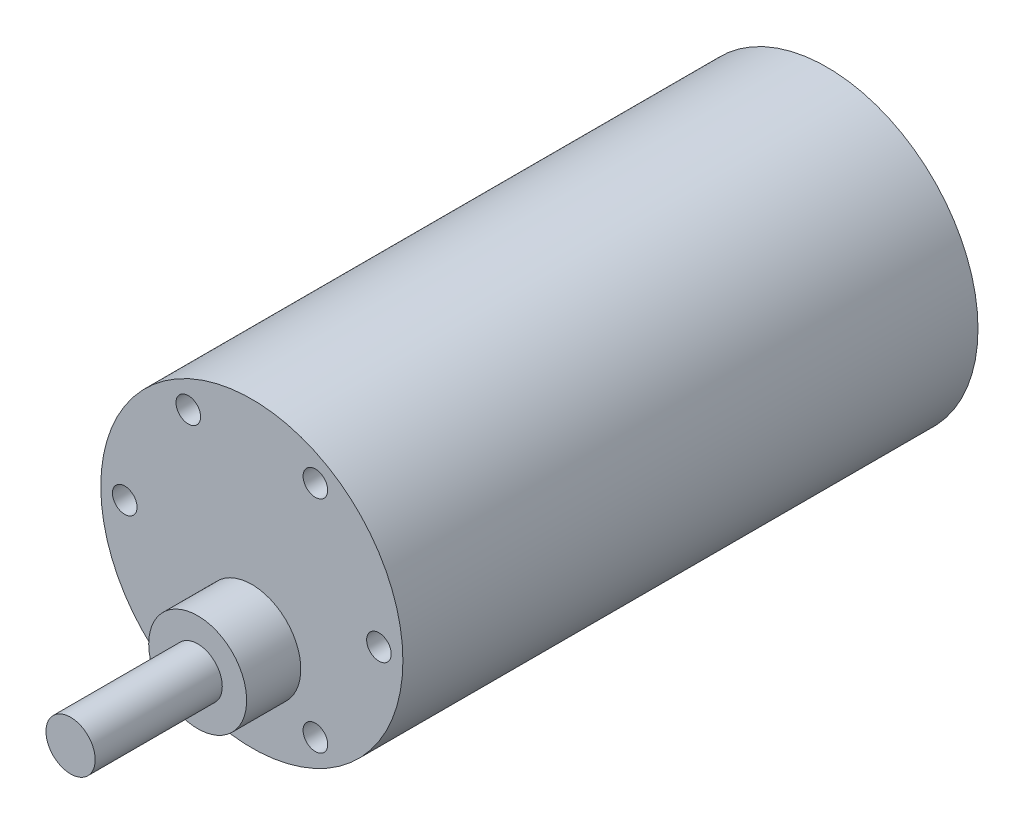
ISO-10303-21;
HEADER;
FILE_DESCRIPTION(('STEP AP214'),'2;1');
FILE_NAME('part.step','',(''),(''),'','','');
FILE_SCHEMA(('AUTOMOTIVE_DESIGN { 1 0 10303 214 1 1 1 1 }'));
ENDSEC;
DATA;
#1=APPLICATION_CONTEXT('core data for automotive mechanical design processes');
#2=APPLICATION_PROTOCOL_DEFINITION('international standard','automotive_design',2000,#1);
#3=PRODUCT_CONTEXT('',#1,'mechanical');
#4=PRODUCT('Part','Part','',(#3));
#5=PRODUCT_RELATED_PRODUCT_CATEGORY('part','',(#4));
#6=PRODUCT_DEFINITION_FORMATION('','',#4);
#7=PRODUCT_DEFINITION_CONTEXT('part definition',#1,'design');
#8=PRODUCT_DEFINITION('design','',#6,#7);
#9=PRODUCT_DEFINITION_SHAPE('','',#8);
#10=(LENGTH_UNIT() NAMED_UNIT(*) SI_UNIT(.MILLI.,.METRE.));
#11=(NAMED_UNIT(*) PLANE_ANGLE_UNIT() SI_UNIT($,.RADIAN.));
#12=(NAMED_UNIT(*) SI_UNIT($,.STERADIAN.) SOLID_ANGLE_UNIT());
#13=UNCERTAINTY_MEASURE_WITH_UNIT(LENGTH_MEASURE(1.E-05),#10,'distance_accuracy_value','');
#14=(GEOMETRIC_REPRESENTATION_CONTEXT(3) GLOBAL_UNCERTAINTY_ASSIGNED_CONTEXT((#13)) GLOBAL_UNIT_ASSIGNED_CONTEXT((#10,
#11,#12)) REPRESENTATION_CONTEXT('',''));
#15=CARTESIAN_POINT('',(0.,0.,0.));
#16=DIRECTION('',(0.,0.,1.));
#17=DIRECTION('',(1.,0.,0.));
#18=AXIS2_PLACEMENT_3D('',#15,#16,#17);
#19=CARTESIAN_POINT('',(0.,0.,70.104));
#20=DIRECTION('',(0.,0.,-1.));
#21=DIRECTION('',(-1.,0.,0.));
#22=AXIS2_PLACEMENT_3D('',#19,#20,#21);
#23=CYLINDRICAL_SURFACE('',#22,18.415);
#24=CARTESIAN_POINT('',(0.,0.,70.104));
#25=DIRECTION('',(0.,0.,1.));
#26=DIRECTION('',(1.,0.,0.));
#27=AXIS2_PLACEMENT_3D('',#24,#25,#26);
#28=CIRCLE('',#27,18.415);
#29=CARTESIAN_POINT('',(18.415,0.,70.104));
#30=VERTEX_POINT('',#29);
#31=EDGE_CURVE('E10',#30,#30,#28,.T.);
#32=ORIENTED_EDGE('',*,*,#31,.F.);
#33=EDGE_LOOP('',(#32));
#34=FACE_BOUND('',#33,.T.);
#35=CARTESIAN_POINT('',(0.,0.,0.));
#36=DIRECTION('',(0.,0.,1.));
#37=DIRECTION('',(1.,0.,0.));
#38=AXIS2_PLACEMENT_3D('',#35,#36,#37);
#39=CIRCLE('',#38,18.415);
#40=CARTESIAN_POINT('',(18.415,0.,0.));
#41=VERTEX_POINT('',#40);
#42=EDGE_CURVE('E35',#41,#41,#39,.T.);
#43=ORIENTED_EDGE('',*,*,#42,.T.);
#44=EDGE_LOOP('',(#43));
#45=FACE_BOUND('',#44,.T.);
#46=ADVANCED_FACE('F32',(#34,#45),#23,.T.);
#47=CARTESIAN_POINT('',(0.,0.,70.104));
#48=DIRECTION('',(0.,0.,1.));
#49=DIRECTION('',(1.,0.,0.));
#50=AXIS2_PLACEMENT_3D('',#47,#48,#49);
#51=PLANE('',#50);
#52=CARTESIAN_POINT('',(7.747,-13.4181976062361,70.104));
#53=DIRECTION('',(0.,0.,1.));
#54=DIRECTION('',(1.,0.,0.));
#55=AXIS2_PLACEMENT_3D('',#52,#53,#54);
#56=CIRCLE('',#55,1.5);
#57=CARTESIAN_POINT('',(9.247,-13.4181976062361,70.104));
#58=VERTEX_POINT('',#57);
#59=EDGE_CURVE('E74',#58,#58,#56,.T.);
#60=ORIENTED_EDGE('',*,*,#59,.F.);
#61=EDGE_LOOP('',(#60));
#62=FACE_BOUND('',#61,.T.);
#63=CARTESIAN_POINT('',(-7.747,-13.4181976062361,70.104));
#64=DIRECTION('',(0.,0.,1.));
#65=DIRECTION('',(1.,0.,0.));
#66=AXIS2_PLACEMENT_3D('',#63,#64,#65);
#67=CIRCLE('',#66,1.5);
#68=CARTESIAN_POINT('',(-6.247,-13.4181976062361,70.104));
#69=VERTEX_POINT('',#68);
#70=EDGE_CURVE('E80',#69,#69,#67,.T.);
#71=ORIENTED_EDGE('',*,*,#70,.F.);
#72=EDGE_LOOP('',(#71));
#73=FACE_BOUND('',#72,.T.);
#74=CARTESIAN_POINT('',(-7.747,13.4181976062361,70.104));
#75=DIRECTION('',(0.,0.,1.));
#76=DIRECTION('',(1.,0.,0.));
#77=AXIS2_PLACEMENT_3D('',#74,#75,#76);
#78=CIRCLE('',#77,1.5);
#79=CARTESIAN_POINT('',(-6.247,13.4181976062361,70.104));
#80=VERTEX_POINT('',#79);
#81=EDGE_CURVE('E86',#80,#80,#78,.T.);
#82=ORIENTED_EDGE('',*,*,#81,.F.);
#83=EDGE_LOOP('',(#82));
#84=FACE_BOUND('',#83,.T.);
#85=CARTESIAN_POINT('',(7.747,13.4181976062361,70.104));
#86=DIRECTION('',(0.,0.,1.));
#87=DIRECTION('',(1.,0.,0.));
#88=AXIS2_PLACEMENT_3D('',#85,#86,#87);
#89=CIRCLE('',#88,1.5);
#90=CARTESIAN_POINT('',(9.247,13.4181976062361,70.104));
#91=VERTEX_POINT('',#90);
#92=EDGE_CURVE('E62',#91,#91,#89,.T.);
#93=ORIENTED_EDGE('',*,*,#92,.F.);
#94=EDGE_LOOP('',(#93));
#95=FACE_BOUND('',#94,.T.);
#96=CARTESIAN_POINT('',(15.494,0.,70.104));
#97=DIRECTION('',(0.,0.,1.));
#98=DIRECTION('',(1.,0.,0.));
#99=AXIS2_PLACEMENT_3D('',#96,#97,#98);
#100=CIRCLE('',#99,1.5);
#101=CARTESIAN_POINT('',(16.994,0.,70.104));
#102=VERTEX_POINT('',#101);
#103=EDGE_CURVE('E69',#102,#102,#100,.T.);
#104=ORIENTED_EDGE('',*,*,#103,.F.);
#105=EDGE_LOOP('',(#104));
#106=FACE_BOUND('',#105,.T.);
#107=CARTESIAN_POINT('',(-15.494,0.,70.104));
#108=DIRECTION('',(0.,0.,1.));
#109=DIRECTION('',(1.,0.,0.));
#110=AXIS2_PLACEMENT_3D('',#107,#108,#109);
#111=CIRCLE('',#110,1.5);
#112=CARTESIAN_POINT('',(-13.994,0.,70.104));
#113=VERTEX_POINT('',#112);
#114=EDGE_CURVE('E56',#113,#113,#111,.T.);
#115=ORIENTED_EDGE('',*,*,#114,.F.);
#116=EDGE_LOOP('',(#115));
#117=FACE_BOUND('',#116,.T.);
#118=CARTESIAN_POINT('',(0.,-7.112,70.104));
#119=DIRECTION('',(0.,0.,1.));
#120=DIRECTION('',(1.,0.,0.));
#121=AXIS2_PLACEMENT_3D('',#118,#119,#120);
#122=CIRCLE('',#121,5.969);
#123=CARTESIAN_POINT('',(-5.969,-7.112,70.104));
#124=VERTEX_POINT('',#123);
#125=EDGE_CURVE('E44',#124,#124,#122,.T.);
#126=ORIENTED_EDGE('',*,*,#125,.F.);
#127=EDGE_LOOP('',(#126));
#128=FACE_BOUND('',#127,.T.);
#129=ORIENTED_EDGE('',*,*,#31,.T.);
#130=EDGE_LOOP('',(#129));
#131=FACE_BOUND('',#130,.T.);
#132=ADVANCED_FACE('F101',(#62,#73,#84,#95,#106,#117,#128,#131),#51,.T.);
#133=CARTESIAN_POINT('',(0.,0.,0.));
#134=DIRECTION('',(0.,0.,1.));
#135=DIRECTION('',(1.,0.,0.));
#136=AXIS2_PLACEMENT_3D('',#133,#134,#135);
#137=PLANE('',#136);
#138=ORIENTED_EDGE('',*,*,#42,.F.);
#139=EDGE_LOOP('',(#138));
#140=FACE_BOUND('',#139,.T.);
#141=ADVANCED_FACE('F104',(#140),#137,.F.);
#142=CARTESIAN_POINT('',(0.,-7.112,76.708));
#143=DIRECTION('',(0.,0.,-1.));
#144=DIRECTION('',(-1.,0.,0.));
#145=AXIS2_PLACEMENT_3D('',#142,#143,#144);
#146=CYLINDRICAL_SURFACE('',#145,5.969);
#147=CARTESIAN_POINT('',(0.,-7.112,76.708));
#148=DIRECTION('',(0.,0.,1.));
#149=DIRECTION('',(1.,0.,0.));
#150=AXIS2_PLACEMENT_3D('',#147,#148,#149);
#151=CIRCLE('',#150,5.969);
#152=CARTESIAN_POINT('',(-5.969,-7.112,76.708));
#153=VERTEX_POINT('',#152);
#154=EDGE_CURVE('E42',#153,#153,#151,.T.);
#155=CARTESIAN_POINT('',(-5.969,-7.112,76.708));
#156=CARTESIAN_POINT('',(-5.969,-7.112,76.6392083333333));
#157=CARTESIAN_POINT('',(-5.969,-7.112,76.5704166666666));
#158=CARTESIAN_POINT('',(-5.969,-7.112,76.4328333333333));
#159=CARTESIAN_POINT('',(-5.969,-7.112,76.3640416666667));
#160=CARTESIAN_POINT('',(-5.969,-7.112,76.2264583333333));
#161=CARTESIAN_POINT('',(-5.969,-7.112,76.1576666666666));
#162=CARTESIAN_POINT('',(-5.969,-7.112,76.0200833333333));
#163=CARTESIAN_POINT('',(-5.969,-7.112,75.9512916666666));
#164=CARTESIAN_POINT('',(-5.969,-7.112,75.8137083333333));
#165=CARTESIAN_POINT('',(-5.969,-7.112,75.7449166666667));
#166=CARTESIAN_POINT('',(-5.969,-7.112,75.6073333333333));
#167=CARTESIAN_POINT('',(-5.969,-7.112,75.5385416666666));
#168=CARTESIAN_POINT('',(-5.969,-7.112,75.4009583333333));
#169=CARTESIAN_POINT('',(-5.969,-7.112,75.3321666666666));
#170=CARTESIAN_POINT('',(-5.969,-7.112,75.1945833333333));
#171=CARTESIAN_POINT('',(-5.969,-7.112,75.1257916666666));
#172=CARTESIAN_POINT('',(-5.969,-7.112,74.9882083333333));
#173=CARTESIAN_POINT('',(-5.969,-7.112,74.9194166666666));
#174=CARTESIAN_POINT('',(-5.969,-7.112,74.7818333333333));
#175=CARTESIAN_POINT('',(-5.969,-7.112,74.7130416666666));
#176=CARTESIAN_POINT('',(-5.969,-7.112,74.5754583333333));
#177=CARTESIAN_POINT('',(-5.969,-7.112,74.5066666666666));
#178=CARTESIAN_POINT('',(-5.969,-7.112,74.3690833333333));
#179=CARTESIAN_POINT('',(-5.969,-7.112,74.3002916666666));
#180=CARTESIAN_POINT('',(-5.969,-7.112,74.1627083333333));
#181=CARTESIAN_POINT('',(-5.969,-7.112,74.0939166666666));
#182=CARTESIAN_POINT('',(-5.969,-7.112,73.9563333333333));
#183=CARTESIAN_POINT('',(-5.969,-7.112,73.8875416666666));
#184=CARTESIAN_POINT('',(-5.969,-7.112,73.7499583333333));
#185=CARTESIAN_POINT('',(-5.969,-7.112,73.6811666666666));
#186=CARTESIAN_POINT('',(-5.969,-7.112,73.5435833333333));
#187=CARTESIAN_POINT('',(-5.969,-7.112,73.4747916666666));
#188=CARTESIAN_POINT('',(-5.969,-7.112,73.3372083333333));
#189=CARTESIAN_POINT('',(-5.969,-7.112,73.2684166666666));
#190=CARTESIAN_POINT('',(-5.969,-7.112,73.1308333333333));
#191=CARTESIAN_POINT('',(-5.969,-7.112,73.0620416666666));
#192=CARTESIAN_POINT('',(-5.969,-7.112,72.9244583333333));
#193=CARTESIAN_POINT('',(-5.969,-7.112,72.8556666666666));
#194=CARTESIAN_POINT('',(-5.969,-7.112,72.7180833333333));
#195=CARTESIAN_POINT('',(-5.969,-7.112,72.6492916666666));
#196=CARTESIAN_POINT('',(-5.969,-7.112,72.5117083333333));
#197=CARTESIAN_POINT('',(-5.969,-7.112,72.4429166666666));
#198=CARTESIAN_POINT('',(-5.969,-7.112,72.3053333333333));
#199=CARTESIAN_POINT('',(-5.969,-7.112,72.2365416666666));
#200=CARTESIAN_POINT('',(-5.969,-7.112,72.0989583333333));
#201=CARTESIAN_POINT('',(-5.969,-7.112,72.0301666666666));
#202=CARTESIAN_POINT('',(-5.969,-7.112,71.8925833333333));
#203=CARTESIAN_POINT('',(-5.969,-7.112,71.8237916666667));
#204=CARTESIAN_POINT('',(-5.969,-7.112,71.6862083333333));
#205=CARTESIAN_POINT('',(-5.969,-7.112,71.6174166666666));
#206=CARTESIAN_POINT('',(-5.969,-7.112,71.4798333333333));
#207=CARTESIAN_POINT('',(-5.969,-7.112,71.4110416666666));
#208=CARTESIAN_POINT('',(-5.969,-7.112,71.2734583333333));
#209=CARTESIAN_POINT('',(-5.969,-7.112,71.2046666666666));
#210=CARTESIAN_POINT('',(-5.969,-7.112,71.0670833333333));
#211=CARTESIAN_POINT('',(-5.969,-7.112,70.9982916666666));
#212=CARTESIAN_POINT('',(-5.969,-7.112,70.8607083333333));
#213=CARTESIAN_POINT('',(-5.969,-7.112,70.7919166666667));
#214=CARTESIAN_POINT('',(-5.969,-7.112,70.6543333333333));
#215=CARTESIAN_POINT('',(-5.969,-7.112,70.5855416666666));
#216=CARTESIAN_POINT('',(-5.969,-7.112,70.4479583333333));
#217=CARTESIAN_POINT('',(-5.969,-7.112,70.3791666666666));
#218=CARTESIAN_POINT('',(-5.969,-7.112,70.2415833333333));
#219=CARTESIAN_POINT('',(-5.969,-7.112,70.1727916666667));
#220=CARTESIAN_POINT('',(-5.969,-7.112,70.104));
#221=B_SPLINE_CURVE_WITH_KNOTS('',3,(#155,#156,#157,#158,#159,#160,#161,#162,#163,#164,#165,
#166,#167,#168,#169,#170,#171,#172,#173,#174,#175,#176,#177,#178,#179,#180,#181,#182,#183,#184,
#185,#186,#187,#188,#189,#190,#191,#192,#193,#194,#195,#196,#197,#198,#199,#200,#201,#202,#203,
#204,#205,#206,#207,#208,#209,#210,#211,#212,#213,#214,#215,#216,#217,#218,#219,#220),
.UNSPECIFIED.,.F.,.F.,(4,2,2,2,2,2,2,2,2,2,2,2,2,2,2,2,2,2,2,2,2,2,2,2,2,2,2,2,2,2,2,2,4),(0.,
0.206375000000009,0.412750000000003,0.619125000000012,0.825500000000007,1.031875,
1.23825000000001,1.444625,1.651,1.85737500000001,2.06375,2.27012500000001,2.47650000000001,
2.682875,2.88925000000001,3.095625,3.302,3.50837500000001,3.71475,3.92112500000001,
4.12750000000001,4.333875,4.54025000000001,4.746625,4.953,5.15937500000001,5.36575,
5.57212500000001,5.77850000000001,5.984875,6.19125000000001,6.397625,6.604),.UNSPECIFIED.);
#222=EDGE_CURVE('BSEAM115',#153,#124,#221,.T.);
#223=ORIENTED_EDGE('',*,*,#154,.F.);
#224=ORIENTED_EDGE('',*,*,#125,.T.);
#225=ORIENTED_EDGE('',*,*,#222,.T.);
#226=ORIENTED_EDGE('',*,*,#222,.F.);
#227=EDGE_LOOP('',(#223,#225,#224,#226));
#228=FACE_BOUND('',#227,.T.);
#229=ADVANCED_FACE('F115',(#228),#146,.T.);
#230=CARTESIAN_POINT('',(0.,-7.112,76.708));
#231=DIRECTION('',(0.,0.,1.));
#232=DIRECTION('',(1.,0.,0.));
#233=AXIS2_PLACEMENT_3D('',#230,#231,#232);
#234=PLANE('',#233);
#235=CARTESIAN_POINT('',(0.,-7.112,76.708));
#236=DIRECTION('',(0.,0.,1.));
#237=DIRECTION('',(1.,0.,0.));
#238=AXIS2_PLACEMENT_3D('',#235,#236,#237);
#239=CIRCLE('',#238,3.);
#240=CARTESIAN_POINT('',(3.,-7.112,76.708));
#241=VERTEX_POINT('',#240);
#242=EDGE_CURVE('E50',#241,#241,#239,.T.);
#243=ORIENTED_EDGE('',*,*,#242,.F.);
#244=EDGE_LOOP('',(#243));
#245=FACE_BOUND('',#244,.T.);
#246=ORIENTED_EDGE('',*,*,#154,.T.);
#247=EDGE_LOOP('',(#246));
#248=FACE_BOUND('',#247,.T.);
#249=ADVANCED_FACE('F117',(#245,#248),#234,.T.);
#250=CARTESIAN_POINT('',(0.,-7.112,92.202));
#251=DIRECTION('',(0.,0.,-1.));
#252=DIRECTION('',(-1.,0.,0.));
#253=AXIS2_PLACEMENT_3D('',#250,#251,#252);
#254=CYLINDRICAL_SURFACE('',#253,3.);
#255=CARTESIAN_POINT('',(0.,-7.112,92.202));
#256=DIRECTION('',(0.,0.,1.));
#257=DIRECTION('',(1.,0.,0.));
#258=AXIS2_PLACEMENT_3D('',#255,#256,#257);
#259=CIRCLE('',#258,3.);
#260=CARTESIAN_POINT('',(3.,-7.112,92.202));
#261=VERTEX_POINT('',#260);
#262=EDGE_CURVE('E47',#261,#261,#259,.T.);
#263=ORIENTED_EDGE('',*,*,#262,.F.);
#264=EDGE_LOOP('',(#263));
#265=FACE_BOUND('',#264,.T.);
#266=ORIENTED_EDGE('',*,*,#242,.T.);
#267=EDGE_LOOP('',(#266));
#268=FACE_BOUND('',#267,.T.);
#269=ADVANCED_FACE('F124',(#265,#268),#254,.T.);
#270=CARTESIAN_POINT('',(0.,-7.112,92.202));
#271=DIRECTION('',(0.,0.,1.));
#272=DIRECTION('',(1.,0.,0.));
#273=AXIS2_PLACEMENT_3D('',#270,#271,#272);
#274=PLANE('',#273);
#275=ORIENTED_EDGE('',*,*,#262,.T.);
#276=EDGE_LOOP('',(#275));
#277=FACE_BOUND('',#276,.T.);
#278=ADVANCED_FACE('F163',(#277),#274,.T.);
#279=CARTESIAN_POINT('',(-15.494,0.,44.704));
#280=DIRECTION('',(0.,0.,1.));
#281=DIRECTION('',(1.,0.,0.));
#282=AXIS2_PLACEMENT_3D('',#279,#280,#281);
#283=CYLINDRICAL_SURFACE('',#282,1.5);
#284=CARTESIAN_POINT('',(-15.494,0.,44.704));
#285=DIRECTION('',(0.,0.,1.));
#286=DIRECTION('',(1.,0.,0.));
#287=AXIS2_PLACEMENT_3D('',#284,#285,#286);
#288=CIRCLE('',#287,1.5);
#289=CARTESIAN_POINT('',(-13.994,0.,44.704));
#290=VERTEX_POINT('',#289);
#291=EDGE_CURVE('E53',#290,#290,#288,.T.);
#292=ORIENTED_EDGE('',*,*,#291,.F.);
#293=EDGE_LOOP('',(#292));
#294=FACE_BOUND('',#293,.T.);
#295=ORIENTED_EDGE('',*,*,#114,.T.);
#296=EDGE_LOOP('',(#295));
#297=FACE_BOUND('',#296,.T.);
#298=ADVANCED_FACE('F172',(#294,#297),#283,.F.);
#299=CARTESIAN_POINT('',(-15.494,0.,44.704));
#300=DIRECTION('',(0.,0.,1.));
#301=DIRECTION('',(1.,0.,0.));
#302=AXIS2_PLACEMENT_3D('',#299,#300,#301);
#303=PLANE('',#302);
#304=ORIENTED_EDGE('',*,*,#291,.T.);
#305=EDGE_LOOP('',(#304));
#306=FACE_BOUND('',#305,.T.);
#307=ADVANCED_FACE('F182',(#306),#303,.T.);
#308=CARTESIAN_POINT('',(15.494,0.,44.704));
#309=DIRECTION('',(0.,0.,1.));
#310=DIRECTION('',(1.,0.,0.));
#311=AXIS2_PLACEMENT_3D('',#308,#309,#310);
#312=CYLINDRICAL_SURFACE('',#311,1.5);
#313=CARTESIAN_POINT('',(15.494,0.,44.704));
#314=DIRECTION('',(0.,0.,1.));
#315=DIRECTION('',(1.,0.,0.));
#316=AXIS2_PLACEMENT_3D('',#313,#314,#315);
#317=CIRCLE('',#316,1.5);
#318=CARTESIAN_POINT('',(16.994,0.,44.704));
#319=VERTEX_POINT('',#318);
#320=EDGE_CURVE('E59',#319,#319,#317,.T.);
#321=ORIENTED_EDGE('',*,*,#320,.F.);
#322=EDGE_LOOP('',(#321));
#323=FACE_BOUND('',#322,.T.);
#324=ORIENTED_EDGE('',*,*,#103,.T.);
#325=EDGE_LOOP('',(#324));
#326=FACE_BOUND('',#325,.T.);
#327=ADVANCED_FACE('F189',(#323,#326),#312,.F.);
#328=CARTESIAN_POINT('',(15.494,0.,44.704));
#329=DIRECTION('',(0.,0.,1.));
#330=DIRECTION('',(1.,0.,0.));
#331=AXIS2_PLACEMENT_3D('',#328,#329,#330);
#332=PLANE('',#331);
#333=ORIENTED_EDGE('',*,*,#320,.T.);
#334=EDGE_LOOP('',(#333));
#335=FACE_BOUND('',#334,.T.);
#336=ADVANCED_FACE('F197',(#335),#332,.T.);
#337=CARTESIAN_POINT('',(7.747,13.4181976062361,44.704));
#338=DIRECTION('',(0.,0.,1.));
#339=DIRECTION('',(1.,0.,0.));
#340=AXIS2_PLACEMENT_3D('',#337,#338,#339);
#341=CYLINDRICAL_SURFACE('',#340,1.5);
#342=CARTESIAN_POINT('',(7.747,13.4181976062361,44.704));
#343=DIRECTION('',(0.,0.,1.));
#344=DIRECTION('',(1.,0.,0.));
#345=AXIS2_PLACEMENT_3D('',#342,#343,#344);
#346=CIRCLE('',#345,1.5);
#347=CARTESIAN_POINT('',(9.247,13.4181976062361,44.704));
#348=VERTEX_POINT('',#347);
#349=EDGE_CURVE('E65',#348,#348,#346,.T.);
#350=ORIENTED_EDGE('',*,*,#349,.F.);
#351=EDGE_LOOP('',(#350));
#352=FACE_BOUND('',#351,.T.);
#353=ORIENTED_EDGE('',*,*,#92,.T.);
#354=EDGE_LOOP('',(#353));
#355=FACE_BOUND('',#354,.T.);
#356=ADVANCED_FACE('F205',(#352,#355),#341,.F.);
#357=CARTESIAN_POINT('',(7.747,13.4181976062361,44.704));
#358=DIRECTION('',(0.,0.,1.));
#359=DIRECTION('',(1.,0.,0.));
#360=AXIS2_PLACEMENT_3D('',#357,#358,#359);
#361=PLANE('',#360);
#362=ORIENTED_EDGE('',*,*,#349,.T.);
#363=EDGE_LOOP('',(#362));
#364=FACE_BOUND('',#363,.T.);
#365=ADVANCED_FACE('F97',(#364),#361,.T.);
#366=CARTESIAN_POINT('',(-7.747,13.4181976062361,44.704));
#367=DIRECTION('',(0.,0.,1.));
#368=DIRECTION('',(1.,0.,0.));
#369=AXIS2_PLACEMENT_3D('',#366,#367,#368);
#370=CYLINDRICAL_SURFACE('',#369,1.5);
#371=CARTESIAN_POINT('',(-7.747,13.4181976062361,44.704));
#372=DIRECTION('',(0.,0.,1.));
#373=DIRECTION('',(1.,0.,0.));
#374=AXIS2_PLACEMENT_3D('',#371,#372,#373);
#375=CIRCLE('',#374,1.5);
#376=CARTESIAN_POINT('',(-6.247,13.4181976062361,44.704));
#377=VERTEX_POINT('',#376);
#378=EDGE_CURVE('E66',#377,#377,#375,.T.);
#379=ORIENTED_EDGE('',*,*,#378,.F.);
#380=EDGE_LOOP('',(#379));
#381=FACE_BOUND('',#380,.T.);
#382=ORIENTED_EDGE('',*,*,#81,.T.);
#383=EDGE_LOOP('',(#382));
#384=FACE_BOUND('',#383,.T.);
#385=ADVANCED_FACE('F94',(#381,#384),#370,.F.);
#386=CARTESIAN_POINT('',(-7.747,13.4181976062361,44.704));
#387=DIRECTION('',(0.,0.,1.));
#388=DIRECTION('',(1.,0.,0.));
#389=AXIS2_PLACEMENT_3D('',#386,#387,#388);
#390=PLANE('',#389);
#391=ORIENTED_EDGE('',*,*,#378,.T.);
#392=EDGE_LOOP('',(#391));
#393=FACE_BOUND('',#392,.T.);
#394=ADVANCED_FACE('F92',(#393),#390,.T.);
#395=CARTESIAN_POINT('',(-7.747,-13.4181976062361,44.704));
#396=DIRECTION('',(0.,0.,1.));
#397=DIRECTION('',(1.,0.,0.));
#398=AXIS2_PLACEMENT_3D('',#395,#396,#397);
#399=CYLINDRICAL_SURFACE('',#398,1.5);
#400=CARTESIAN_POINT('',(-7.747,-13.4181976062361,44.704));
#401=DIRECTION('',(0.,0.,1.));
#402=DIRECTION('',(1.,0.,0.));
#403=AXIS2_PLACEMENT_3D('',#400,#401,#402);
#404=CIRCLE('',#403,1.5);
#405=CARTESIAN_POINT('',(-6.247,-13.4181976062361,44.704));
#406=VERTEX_POINT('',#405);
#407=EDGE_CURVE('E83',#406,#406,#404,.T.);
#408=ORIENTED_EDGE('',*,*,#407,.F.);
#409=EDGE_LOOP('',(#408));
#410=FACE_BOUND('',#409,.T.);
#411=ORIENTED_EDGE('',*,*,#70,.T.);
#412=EDGE_LOOP('',(#411));
#413=FACE_BOUND('',#412,.T.);
#414=ADVANCED_FACE('F231',(#410,#413),#399,.F.);
#415=CARTESIAN_POINT('',(-7.747,-13.4181976062361,44.704));
#416=DIRECTION('',(0.,0.,1.));
#417=DIRECTION('',(1.,0.,0.));
#418=AXIS2_PLACEMENT_3D('',#415,#416,#417);
#419=PLANE('',#418);
#420=ORIENTED_EDGE('',*,*,#407,.T.);
#421=EDGE_LOOP('',(#420));
#422=FACE_BOUND('',#421,.T.);
#423=ADVANCED_FACE('F238',(#422),#419,.T.);
#424=CARTESIAN_POINT('',(7.747,-13.4181976062361,44.704));
#425=DIRECTION('',(0.,0.,1.));
#426=DIRECTION('',(1.,0.,0.));
#427=AXIS2_PLACEMENT_3D('',#424,#425,#426);
#428=CYLINDRICAL_SURFACE('',#427,1.5);
#429=CARTESIAN_POINT('',(7.747,-13.4181976062361,44.704));
#430=DIRECTION('',(0.,0.,1.));
#431=DIRECTION('',(1.,0.,0.));
#432=AXIS2_PLACEMENT_3D('',#429,#430,#431);
#433=CIRCLE('',#432,1.5);
#434=CARTESIAN_POINT('',(9.247,-13.4181976062361,44.704));
#435=VERTEX_POINT('',#434);
#436=EDGE_CURVE('E77',#435,#435,#433,.T.);
#437=ORIENTED_EDGE('',*,*,#436,.F.);
#438=EDGE_LOOP('',(#437));
#439=FACE_BOUND('',#438,.T.);
#440=ORIENTED_EDGE('',*,*,#59,.T.);
#441=EDGE_LOOP('',(#440));
#442=FACE_BOUND('',#441,.T.);
#443=ADVANCED_FACE('F246',(#439,#442),#428,.F.);
#444=CARTESIAN_POINT('',(7.747,-13.4181976062361,44.704));
#445=DIRECTION('',(0.,0.,1.));
#446=DIRECTION('',(1.,0.,0.));
#447=AXIS2_PLACEMENT_3D('',#444,#445,#446);
#448=PLANE('',#447);
#449=ORIENTED_EDGE('',*,*,#436,.T.);
#450=EDGE_LOOP('',(#449));
#451=FACE_BOUND('',#450,.T.);
#452=ADVANCED_FACE('F254',(#451),#448,.T.);
#453=CLOSED_SHELL('',(#46,#132,#141,#229,#249,#269,#278,#298,#307,#327,#336,#356,#365,#385,#394,
#414,#423,#443,#452));
#454=MANIFOLD_SOLID_BREP('B2',#453);
#455=ADVANCED_BREP_SHAPE_REPRESENTATION('',(#18,#454),#14);
#456=SHAPE_DEFINITION_REPRESENTATION(#9,#455);
ENDSEC;
END-ISO-10303-21;
